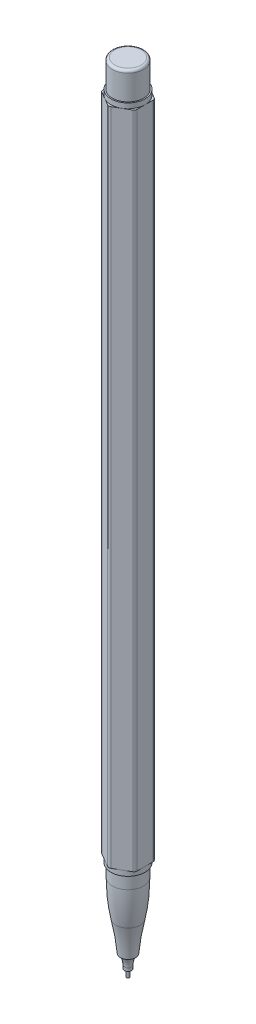
ISO-10303-21;
HEADER;
FILE_DESCRIPTION(('STEP AP214'),'2;1');
FILE_NAME('part.step','',(''),(''),'','','');
FILE_SCHEMA(('AUTOMOTIVE_DESIGN { 1 0 10303 214 1 1 1 1 }'));
ENDSEC;
DATA;
#1=APPLICATION_CONTEXT('core data for automotive mechanical design processes');
#2=APPLICATION_PROTOCOL_DEFINITION('international standard','automotive_design',2000,#1);
#3=PRODUCT_CONTEXT('',#1,'mechanical');
#4=PRODUCT('Part','Part','',(#3));
#5=PRODUCT_RELATED_PRODUCT_CATEGORY('part','',(#4));
#6=PRODUCT_DEFINITION_FORMATION('','',#4);
#7=PRODUCT_DEFINITION_CONTEXT('part definition',#1,'design');
#8=PRODUCT_DEFINITION('design','',#6,#7);
#9=PRODUCT_DEFINITION_SHAPE('','',#8);
#10=(LENGTH_UNIT() NAMED_UNIT(*) SI_UNIT(.MILLI.,.METRE.));
#11=(NAMED_UNIT(*) PLANE_ANGLE_UNIT() SI_UNIT($,.RADIAN.));
#12=(NAMED_UNIT(*) SI_UNIT($,.STERADIAN.) SOLID_ANGLE_UNIT());
#13=UNCERTAINTY_MEASURE_WITH_UNIT(LENGTH_MEASURE(1.E-05),#10,'distance_accuracy_value','');
#14=(GEOMETRIC_REPRESENTATION_CONTEXT(3) GLOBAL_UNCERTAINTY_ASSIGNED_CONTEXT((#13)) GLOBAL_UNIT_ASSIGNED_CONTEXT((#10,
#11,#12)) REPRESENTATION_CONTEXT('',''));
#15=CARTESIAN_POINT('',(0.,0.,0.));
#16=DIRECTION('',(0.,0.,1.));
#17=DIRECTION('',(1.,0.,0.));
#18=AXIS2_PLACEMENT_3D('',#15,#16,#17);
#19=CARTESIAN_POINT('',(-2.74999999999998,0.,1.58771324027151));
#20=DIRECTION('',(0.,1.,0.));
#21=DIRECTION('',(0.,0.,1.));
#22=AXIS2_PLACEMENT_3D('',#19,#20,#21);
#23=PLANE('',#22);
#24=CARTESIAN_POINT('',(0.,0.,0.));
#25=DIRECTION('',(0.,-1.,0.));
#26=DIRECTION('',(0.,0.,-1.));
#27=AXIS2_PLACEMENT_3D('',#24,#25,#26);
#28=CIRCLE('',#27,3.35000000000002);
#29=CARTESIAN_POINT('',(1.675,0.,-2.9011851026779));
#30=VERTEX_POINT('',#29);
#31=CARTESIAN_POINT('',(3.35,0.,0.));
#32=VERTEX_POINT('',#31);
#33=EDGE_CURVE('E53',#30,#32,#28,.T.);
#34=ORIENTED_EDGE('',*,*,#33,.F.);
#35=DIRECTION('',(-0.866025403784441,0.,-0.499999999999995));
#36=VECTOR('',#35,1.);
#37=CARTESIAN_POINT('',(3.04999999999999,0.,-2.10732848254215));
#38=LINE('',#37,#36);
#39=CARTESIAN_POINT('',(3.04999999999999,0.,-2.10732848254215));
#40=VERTEX_POINT('',#39);
#41=EDGE_CURVE('E171',#40,#30,#38,.T.);
#42=ORIENTED_EDGE('',*,*,#41,.F.);
#43=CARTESIAN_POINT('',(2.74999999999999,0.,-1.58771324027149));
#44=DIRECTION('',(0.,1.,0.));
#45=DIRECTION('',(0.,0.,1.));
#46=AXIS2_PLACEMENT_3D('',#43,#44,#45);
#47=CIRCLE('',#46,0.6);
#48=CARTESIAN_POINT('',(3.34999999999999,0.,-1.58771324027148));
#49=VERTEX_POINT('',#48);
#50=EDGE_CURVE('E194',#49,#40,#47,.T.);
#51=ORIENTED_EDGE('',*,*,#50,.F.);
#52=DIRECTION('',(0.,0.,-1.));
#53=VECTOR('',#52,1.);
#54=CARTESIAN_POINT('',(3.35000000000001,0.,1.58771324027146));
#55=LINE('',#54,#53);
#56=EDGE_CURVE('E197',#32,#49,#55,.T.);
#57=ORIENTED_EDGE('',*,*,#56,.F.);
#58=EDGE_LOOP('',(#34,#42,#51,#57));
#59=FACE_BOUND('',#58,.T.);
#60=ADVANCED_FACE('F41',(#59),#23,.F.);
#61=CARTESIAN_POINT('',(1.675,0.,2.90118510267787));
#62=VERTEX_POINT('',#61);
#63=EDGE_CURVE('E11',#32,#62,#28,.T.);
#64=ORIENTED_EDGE('',*,*,#63,.F.);
#65=CARTESIAN_POINT('',(3.35000000000001,0.,1.58771324027146));
#66=VERTEX_POINT('',#65);
#67=EDGE_CURVE('E298',#66,#32,#55,.T.);
#68=ORIENTED_EDGE('',*,*,#67,.F.);
#69=CARTESIAN_POINT('',(2.75000000000001,0.,1.58771324027147));
#70=DIRECTION('',(0.,1.,0.));
#71=DIRECTION('',(0.,0.,1.));
#72=AXIS2_PLACEMENT_3D('',#69,#70,#71);
#73=CIRCLE('',#72,0.6);
#74=CARTESIAN_POINT('',(3.05,0.,2.10732848254213));
#75=VERTEX_POINT('',#74);
#76=EDGE_CURVE('E295',#75,#66,#73,.T.);
#77=ORIENTED_EDGE('',*,*,#76,.F.);
#78=DIRECTION('',(0.866025403784438,0.,-0.500000000000001));
#79=VECTOR('',#78,1.);
#80=CARTESIAN_POINT('',(0.3,0.,3.69504172281361));
#81=LINE('',#80,#79);
#82=EDGE_CURVE('E290',#62,#75,#81,.T.);
#83=ORIENTED_EDGE('',*,*,#82,.F.);
#84=EDGE_LOOP('',(#64,#68,#77,#83));
#85=FACE_BOUND('',#84,.T.);
#86=ADVANCED_FACE('F379',(#85),#23,.F.);
#87=CARTESIAN_POINT('',(-1.67499999999999,0.,2.90118510267789));
#88=VERTEX_POINT('',#87);
#89=EDGE_CURVE('E51',#62,#88,#28,.T.);
#90=ORIENTED_EDGE('',*,*,#89,.F.);
#91=CARTESIAN_POINT('',(0.3,0.,3.69504172281361));
#92=VERTEX_POINT('',#91);
#93=EDGE_CURVE('E291',#92,#62,#81,.T.);
#94=ORIENTED_EDGE('',*,*,#93,.F.);
#95=CARTESIAN_POINT('',(0.,0.,3.17542648054295));
#96=DIRECTION('',(0.,1.,0.));
#97=DIRECTION('',(0.,0.,-1.));
#98=AXIS2_PLACEMENT_3D('',#95,#96,#97);
#99=CIRCLE('',#98,0.6);
#100=CARTESIAN_POINT('',(-0.300000000000001,0.,3.69504172281361));
#101=VERTEX_POINT('',#100);
#102=EDGE_CURVE('E287',#101,#92,#99,.T.);
#103=ORIENTED_EDGE('',*,*,#102,.F.);
#104=DIRECTION('',(0.866025403784442,0.,0.499999999999995));
#105=VECTOR('',#104,1.);
#106=CARTESIAN_POINT('',(-3.04999999999998,0.,2.10732848254217));
#107=LINE('',#106,#105);
#108=EDGE_CURVE('E282',#88,#101,#107,.T.);
#109=ORIENTED_EDGE('',*,*,#108,.F.);
#110=EDGE_LOOP('',(#90,#94,#103,#109));
#111=FACE_BOUND('',#110,.T.);
#112=ADVANCED_FACE('F384',(#111),#23,.F.);
#113=CARTESIAN_POINT('',(-3.35,0.,0.));
#114=VERTEX_POINT('',#113);
#115=EDGE_CURVE('E60',#88,#114,#28,.T.);
#116=ORIENTED_EDGE('',*,*,#115,.F.);
#117=CARTESIAN_POINT('',(-3.04999999999998,0.,2.10732848254217));
#118=VERTEX_POINT('',#117);
#119=EDGE_CURVE('E283',#118,#88,#107,.T.);
#120=ORIENTED_EDGE('',*,*,#119,.F.);
#121=CARTESIAN_POINT('',(-2.74999999999998,0.,1.58771324027151));
#122=DIRECTION('',(0.,1.,0.));
#123=DIRECTION('',(0.,0.,1.));
#124=AXIS2_PLACEMENT_3D('',#121,#122,#123);
#125=CIRCLE('',#124,0.6);
#126=CARTESIAN_POINT('',(-3.34999999999998,0.,1.58771324027151));
#127=VERTEX_POINT('',#126);
#128=EDGE_CURVE('E223',#127,#118,#125,.T.);
#129=ORIENTED_EDGE('',*,*,#128,.F.);
#130=DIRECTION('',(0.,0.,1.));
#131=VECTOR('',#130,1.);
#132=CARTESIAN_POINT('',(-3.35000000000002,0.,-1.58771324027144));
#133=LINE('',#132,#131);
#134=EDGE_CURVE('E313',#114,#127,#133,.T.);
#135=ORIENTED_EDGE('',*,*,#134,.F.);
#136=EDGE_LOOP('',(#116,#120,#129,#135));
#137=FACE_BOUND('',#136,.T.);
#138=ADVANCED_FACE('F404',(#137),#23,.F.);
#139=CARTESIAN_POINT('',(-1.67500000000002,0.,-2.90118510267786));
#140=VERTEX_POINT('',#139);
#141=EDGE_CURVE('E205',#114,#140,#28,.T.);
#142=ORIENTED_EDGE('',*,*,#141,.F.);
#143=CARTESIAN_POINT('',(-3.35000000000002,0.,-1.58771324027144));
#144=VERTEX_POINT('',#143);
#145=EDGE_CURVE('E234',#144,#114,#133,.T.);
#146=ORIENTED_EDGE('',*,*,#145,.F.);
#147=CARTESIAN_POINT('',(-2.75000000000002,0.,-1.58771324027145));
#148=DIRECTION('',(0.,1.,0.));
#149=DIRECTION('',(0.,0.,1.));
#150=AXIS2_PLACEMENT_3D('',#147,#148,#149);
#151=CIRCLE('',#150,0.6);
#152=CARTESIAN_POINT('',(-3.05000000000002,0.,-2.10732848254211));
#153=VERTEX_POINT('',#152);
#154=EDGE_CURVE('E310',#153,#144,#151,.T.);
#155=ORIENTED_EDGE('',*,*,#154,.F.);
#156=DIRECTION('',(-0.866025403784435,0.,0.500000000000007));
#157=VECTOR('',#156,1.);
#158=CARTESIAN_POINT('',(-0.300000000000029,0.,-3.6950417228136));
#159=LINE('',#158,#157);
#160=EDGE_CURVE('E305',#140,#153,#159,.T.);
#161=ORIENTED_EDGE('',*,*,#160,.F.);
#162=EDGE_LOOP('',(#142,#146,#155,#161));
#163=FACE_BOUND('',#162,.T.);
#164=ADVANCED_FACE('F391',(#163),#23,.F.);
#165=CARTESIAN_POINT('',(-2.74999999999998,130.,1.58771324027151));
#166=DIRECTION('',(0.,1.,0.));
#167=DIRECTION('',(0.,0.,1.));
#168=AXIS2_PLACEMENT_3D('',#165,#166,#167);
#169=PLANE('',#168);
#170=CARTESIAN_POINT('',(0.,130.,0.));
#171=DIRECTION('',(0.,1.,0.));
#172=DIRECTION('',(0.,0.,1.));
#173=AXIS2_PLACEMENT_3D('',#170,#171,#172);
#174=CIRCLE('',#173,3.35000000000001);
#175=CARTESIAN_POINT('',(1.67500000000001,130.,2.90118510267788));
#176=VERTEX_POINT('',#175);
#177=CARTESIAN_POINT('',(3.35,130.,0.));
#178=VERTEX_POINT('',#177);
#179=EDGE_CURVE('E224',#176,#178,#174,.T.);
#180=ORIENTED_EDGE('',*,*,#179,.F.);
#181=DIRECTION('',(0.866025403784438,0.,-0.500000000000001));
#182=VECTOR('',#181,1.);
#183=CARTESIAN_POINT('',(0.3,130.,3.69504172281361));
#184=LINE('',#183,#182);
#185=CARTESIAN_POINT('',(3.05,130.,2.10732848254213));
#186=VERTEX_POINT('',#185);
#187=EDGE_CURVE('E242',#176,#186,#184,.T.);
#188=ORIENTED_EDGE('',*,*,#187,.T.);
#189=CARTESIAN_POINT('',(2.75000000000001,130.,1.58771324027147));
#190=DIRECTION('',(0.,1.,0.));
#191=DIRECTION('',(0.,0.,1.));
#192=AXIS2_PLACEMENT_3D('',#189,#190,#191);
#193=CIRCLE('',#192,0.6);
#194=CARTESIAN_POINT('',(3.35000000000001,130.,1.58771324027146));
#195=VERTEX_POINT('',#194);
#196=EDGE_CURVE('E246',#186,#195,#193,.T.);
#197=ORIENTED_EDGE('',*,*,#196,.T.);
#198=DIRECTION('',(0.,0.,-1.));
#199=VECTOR('',#198,1.);
#200=CARTESIAN_POINT('',(3.35000000000001,130.,1.58771324027146));
#201=LINE('',#200,#199);
#202=EDGE_CURVE('E250',#195,#178,#201,.T.);
#203=ORIENTED_EDGE('',*,*,#202,.T.);
#204=EDGE_LOOP('',(#180,#188,#197,#203));
#205=FACE_BOUND('',#204,.T.);
#206=ADVANCED_FACE('F401',(#205),#169,.T.);
#207=CARTESIAN_POINT('',(1.67499999999998,130.,-2.90118510267788));
#208=VERTEX_POINT('',#207);
#209=EDGE_CURVE('E218',#178,#208,#174,.T.);
#210=ORIENTED_EDGE('',*,*,#209,.F.);
#211=CARTESIAN_POINT('',(3.34999999999999,130.,-1.58771324027148));
#212=VERTEX_POINT('',#211);
#213=EDGE_CURVE('E249',#178,#212,#201,.T.);
#214=ORIENTED_EDGE('',*,*,#213,.T.);
#215=CARTESIAN_POINT('',(2.74999999999999,130.,-1.58771324027149));
#216=DIRECTION('',(0.,1.,0.));
#217=DIRECTION('',(0.,0.,1.));
#218=AXIS2_PLACEMENT_3D('',#215,#216,#217);
#219=CIRCLE('',#218,0.6);
#220=CARTESIAN_POINT('',(3.04999999999999,130.,-2.10732848254215));
#221=VERTEX_POINT('',#220);
#222=EDGE_CURVE('E254',#212,#221,#219,.T.);
#223=ORIENTED_EDGE('',*,*,#222,.T.);
#224=DIRECTION('',(-0.866025403784441,0.,-0.499999999999995));
#225=VECTOR('',#224,1.);
#226=CARTESIAN_POINT('',(3.04999999999999,130.,-2.10732848254215));
#227=LINE('',#226,#225);
#228=EDGE_CURVE('E258',#221,#208,#227,.T.);
#229=ORIENTED_EDGE('',*,*,#228,.T.);
#230=EDGE_LOOP('',(#210,#214,#223,#229));
#231=FACE_BOUND('',#230,.T.);
#232=ADVANCED_FACE('F410',(#231),#169,.T.);
#233=CARTESIAN_POINT('',(-1.67500000000002,130.,-2.90118510267786));
#234=VERTEX_POINT('',#233);
#235=EDGE_CURVE('E565',#208,#234,#174,.T.);
#236=ORIENTED_EDGE('',*,*,#235,.F.);
#237=CARTESIAN_POINT('',(0.299999999999977,130.,-3.69504172281361));
#238=VERTEX_POINT('',#237);
#239=EDGE_CURVE('E257',#208,#238,#227,.T.);
#240=ORIENTED_EDGE('',*,*,#239,.T.);
#241=CARTESIAN_POINT('',(0.,130.,-3.17542648054295));
#242=DIRECTION('',(0.,1.,0.));
#243=DIRECTION('',(0.,0.,1.));
#244=AXIS2_PLACEMENT_3D('',#241,#242,#243);
#245=CIRCLE('',#244,0.6);
#246=CARTESIAN_POINT('',(-0.300000000000029,130.,-3.6950417228136));
#247=VERTEX_POINT('',#246);
#248=EDGE_CURVE('E262',#238,#247,#245,.T.);
#249=ORIENTED_EDGE('',*,*,#248,.T.);
#250=DIRECTION('',(-0.866025403784435,0.,0.500000000000007));
#251=VECTOR('',#250,1.);
#252=CARTESIAN_POINT('',(-0.300000000000029,130.,-3.6950417228136));
#253=LINE('',#252,#251);
#254=EDGE_CURVE('E266',#247,#234,#253,.T.);
#255=ORIENTED_EDGE('',*,*,#254,.T.);
#256=EDGE_LOOP('',(#236,#240,#249,#255));
#257=FACE_BOUND('',#256,.T.);
#258=ADVANCED_FACE('F567',(#257),#169,.T.);
#259=CARTESIAN_POINT('',(-3.35,130.,0.));
#260=VERTEX_POINT('',#259);
#261=EDGE_CURVE('E562',#234,#260,#174,.T.);
#262=ORIENTED_EDGE('',*,*,#261,.F.);
#263=CARTESIAN_POINT('',(-3.05000000000002,130.,-2.10732848254211));
#264=VERTEX_POINT('',#263);
#265=EDGE_CURVE('E265',#234,#264,#253,.T.);
#266=ORIENTED_EDGE('',*,*,#265,.T.);
#267=CARTESIAN_POINT('',(-2.75000000000002,130.,-1.58771324027145));
#268=DIRECTION('',(0.,1.,0.));
#269=DIRECTION('',(0.,0.,1.));
#270=AXIS2_PLACEMENT_3D('',#267,#268,#269);
#271=CIRCLE('',#270,0.6);
#272=CARTESIAN_POINT('',(-3.35000000000002,130.,-1.58771324027144));
#273=VERTEX_POINT('',#272);
#274=EDGE_CURVE('E270',#264,#273,#271,.T.);
#275=ORIENTED_EDGE('',*,*,#274,.T.);
#276=DIRECTION('',(0.,0.,1.));
#277=VECTOR('',#276,1.);
#278=CARTESIAN_POINT('',(-3.35000000000002,130.,-1.58771324027144));
#279=LINE('',#278,#277);
#280=EDGE_CURVE('E274',#273,#260,#279,.T.);
#281=ORIENTED_EDGE('',*,*,#280,.T.);
#282=EDGE_LOOP('',(#262,#266,#275,#281));
#283=FACE_BOUND('',#282,.T.);
#284=ADVANCED_FACE('F576',(#283),#169,.T.);
#285=CARTESIAN_POINT('',(-1.67499999999999,130.,2.90118510267789));
#286=VERTEX_POINT('',#285);
#287=EDGE_CURVE('E560',#260,#286,#174,.T.);
#288=ORIENTED_EDGE('',*,*,#287,.F.);
#289=CARTESIAN_POINT('',(-3.34999999999998,130.,1.58771324027151));
#290=VERTEX_POINT('',#289);
#291=EDGE_CURVE('E273',#260,#290,#279,.T.);
#292=ORIENTED_EDGE('',*,*,#291,.T.);
#293=CARTESIAN_POINT('',(-2.74999999999998,130.,1.58771324027151));
#294=DIRECTION('',(0.,1.,0.));
#295=DIRECTION('',(0.,0.,1.));
#296=AXIS2_PLACEMENT_3D('',#293,#294,#295);
#297=CIRCLE('',#296,0.6);
#298=CARTESIAN_POINT('',(-3.04999999999998,130.,2.10732848254217));
#299=VERTEX_POINT('',#298);
#300=EDGE_CURVE('E229',#290,#299,#297,.T.);
#301=ORIENTED_EDGE('',*,*,#300,.T.);
#302=DIRECTION('',(0.866025403784442,0.,0.499999999999995));
#303=VECTOR('',#302,1.);
#304=CARTESIAN_POINT('',(-3.04999999999998,130.,2.10732848254217));
#305=LINE('',#304,#303);
#306=EDGE_CURVE('E235',#299,#286,#305,.T.);
#307=ORIENTED_EDGE('',*,*,#306,.T.);
#308=EDGE_LOOP('',(#288,#292,#301,#307));
#309=FACE_BOUND('',#308,.T.);
#310=ADVANCED_FACE('F402',(#309),#169,.T.);
#311=CARTESIAN_POINT('',(-2.74999999999998,130.,1.58771324027151));
#312=DIRECTION('',(0.,-1.,0.));
#313=DIRECTION('',(0.,0.,-1.));
#314=AXIS2_PLACEMENT_3D('',#311,#312,#313);
#315=CYLINDRICAL_SURFACE('',#314,0.6);
#316=ORIENTED_EDGE('',*,*,#128,.T.);
#317=DIRECTION('',(0.,-1.,0.));
#318=VECTOR('',#317,1.);
#319=CARTESIAN_POINT('',(-3.04999999999998,130.,2.10732848254217));
#320=LINE('',#319,#318);
#321=EDGE_CURVE('E357',#299,#118,#320,.T.);
#322=ORIENTED_EDGE('',*,*,#321,.F.);
#323=ORIENTED_EDGE('',*,*,#300,.F.);
#324=DIRECTION('',(0.,-1.,0.));
#325=VECTOR('',#324,1.);
#326=CARTESIAN_POINT('',(-3.34999999999998,130.,1.58771324027151));
#327=LINE('',#326,#325);
#328=EDGE_CURVE('E278',#290,#127,#327,.T.);
#329=ORIENTED_EDGE('',*,*,#328,.T.);
#330=EDGE_LOOP('',(#316,#322,#323,#329));
#331=FACE_BOUND('',#330,.T.);
#332=ADVANCED_FACE('F582',(#331),#315,.T.);
#333=CARTESIAN_POINT('',(-3.04999999999998,130.,2.10732848254217));
#334=DIRECTION('',(0.499999999999995,0.,-0.866025403784442));
#335=DIRECTION('',(-0.866025403784442,0.,-0.499999999999995));
#336=AXIS2_PLACEMENT_3D('',#333,#334,#335);
#337=PLANE('',#336);
#338=ORIENTED_EDGE('',*,*,#119,.T.);
#339=ORIENTED_EDGE('',*,*,#108,.T.);
#340=DIRECTION('',(0.,-1.,0.));
#341=VECTOR('',#340,1.);
#342=CARTESIAN_POINT('',(-0.300000000000001,130.,3.69504172281361));
#343=LINE('',#342,#341);
#344=CARTESIAN_POINT('',(-0.300000000000001,130.,3.69504172281361));
#345=VERTEX_POINT('',#344);
#346=EDGE_CURVE('E353',#345,#101,#343,.T.);
#347=ORIENTED_EDGE('',*,*,#346,.F.);
#348=EDGE_CURVE('E233',#286,#345,#305,.T.);
#349=ORIENTED_EDGE('',*,*,#348,.F.);
#350=ORIENTED_EDGE('',*,*,#306,.F.);
#351=ORIENTED_EDGE('',*,*,#321,.T.);
#352=EDGE_LOOP('',(#338,#339,#347,#349,#350,#351));
#353=FACE_BOUND('',#352,.T.);
#354=ADVANCED_FACE('F437',(#353),#337,.F.);
#355=CARTESIAN_POINT('',(0.,130.,3.17542648054295));
#356=DIRECTION('',(0.,-1.,0.));
#357=DIRECTION('',(0.,0.,-1.));
#358=AXIS2_PLACEMENT_3D('',#355,#356,#357);
#359=CYLINDRICAL_SURFACE('',#358,0.6);
#360=ORIENTED_EDGE('',*,*,#102,.T.);
#361=DIRECTION('',(0.,-1.,0.));
#362=VECTOR('',#361,1.);
#363=CARTESIAN_POINT('',(0.3,130.,3.69504172281361));
#364=LINE('',#363,#362);
#365=CARTESIAN_POINT('',(0.3,130.,3.69504172281361));
#366=VERTEX_POINT('',#365);
#367=EDGE_CURVE('E349',#366,#92,#364,.T.);
#368=ORIENTED_EDGE('',*,*,#367,.F.);
#369=CARTESIAN_POINT('',(0.,130.,3.17542648054295));
#370=DIRECTION('',(0.,1.,0.));
#371=DIRECTION('',(0.,0.,-1.));
#372=AXIS2_PLACEMENT_3D('',#369,#370,#371);
#373=CIRCLE('',#372,0.6);
#374=EDGE_CURVE('E239',#345,#366,#373,.T.);
#375=ORIENTED_EDGE('',*,*,#374,.F.);
#376=ORIENTED_EDGE('',*,*,#346,.T.);
#377=EDGE_LOOP('',(#360,#368,#375,#376));
#378=FACE_BOUND('',#377,.T.);
#379=ADVANCED_FACE('F432',(#378),#359,.T.);
#380=CARTESIAN_POINT('',(0.3,130.,3.69504172281361));
#381=DIRECTION('',(-0.500000000000001,0.,-0.866025403784438));
#382=DIRECTION('',(-0.866025403784438,0.,0.500000000000001));
#383=AXIS2_PLACEMENT_3D('',#380,#381,#382);
#384=PLANE('',#383);
#385=ORIENTED_EDGE('',*,*,#93,.T.);
#386=ORIENTED_EDGE('',*,*,#82,.T.);
#387=DIRECTION('',(0.,-1.,0.));
#388=VECTOR('',#387,1.);
#389=CARTESIAN_POINT('',(3.05,130.,2.10732848254213));
#390=LINE('',#389,#388);
#391=EDGE_CURVE('E345',#186,#75,#390,.T.);
#392=ORIENTED_EDGE('',*,*,#391,.F.);
#393=ORIENTED_EDGE('',*,*,#187,.F.);
#394=EDGE_CURVE('E243',#366,#176,#184,.T.);
#395=ORIENTED_EDGE('',*,*,#394,.F.);
#396=ORIENTED_EDGE('',*,*,#367,.T.);
#397=EDGE_LOOP('',(#385,#386,#392,#393,#395,#396));
#398=FACE_BOUND('',#397,.T.);
#399=ADVANCED_FACE('F427',(#398),#384,.F.);
#400=CARTESIAN_POINT('',(2.75000000000001,130.,1.58771324027147));
#401=DIRECTION('',(0.,-1.,0.));
#402=DIRECTION('',(0.,0.,-1.));
#403=AXIS2_PLACEMENT_3D('',#400,#401,#402);
#404=CYLINDRICAL_SURFACE('',#403,0.6);
#405=ORIENTED_EDGE('',*,*,#76,.T.);
#406=DIRECTION('',(0.,-1.,0.));
#407=VECTOR('',#406,1.);
#408=CARTESIAN_POINT('',(3.35000000000001,130.,1.58771324027146));
#409=LINE('',#408,#407);
#410=EDGE_CURVE('E341',#195,#66,#409,.T.);
#411=ORIENTED_EDGE('',*,*,#410,.F.);
#412=ORIENTED_EDGE('',*,*,#196,.F.);
#413=ORIENTED_EDGE('',*,*,#391,.T.);
#414=EDGE_LOOP('',(#405,#411,#412,#413));
#415=FACE_BOUND('',#414,.T.);
#416=ADVANCED_FACE('F594',(#415),#404,.T.);
#417=CARTESIAN_POINT('',(3.35000000000001,130.,1.58771324027146));
#418=DIRECTION('',(-1.,0.,0.));
#419=DIRECTION('',(0.,0.,1.));
#420=AXIS2_PLACEMENT_3D('',#417,#418,#419);
#421=PLANE('',#420);
#422=ORIENTED_EDGE('',*,*,#67,.T.);
#423=ORIENTED_EDGE('',*,*,#56,.T.);
#424=DIRECTION('',(0.,-1.,0.));
#425=VECTOR('',#424,1.);
#426=CARTESIAN_POINT('',(3.34999999999999,130.,-1.58771324027148));
#427=LINE('',#426,#425);
#428=EDGE_CURVE('E337',#212,#49,#427,.T.);
#429=ORIENTED_EDGE('',*,*,#428,.F.);
#430=ORIENTED_EDGE('',*,*,#213,.F.);
#431=ORIENTED_EDGE('',*,*,#202,.F.);
#432=ORIENTED_EDGE('',*,*,#410,.T.);
#433=EDGE_LOOP('',(#422,#423,#429,#430,#431,#432));
#434=FACE_BOUND('',#433,.T.);
#435=ADVANCED_FACE('F541',(#434),#421,.F.);
#436=CARTESIAN_POINT('',(2.74999999999999,130.,-1.58771324027149));
#437=DIRECTION('',(0.,-1.,0.));
#438=DIRECTION('',(0.,0.,-1.));
#439=AXIS2_PLACEMENT_3D('',#436,#437,#438);
#440=CYLINDRICAL_SURFACE('',#439,0.6);
#441=ORIENTED_EDGE('',*,*,#50,.T.);
#442=DIRECTION('',(0.,-1.,0.));
#443=VECTOR('',#442,1.);
#444=CARTESIAN_POINT('',(3.04999999999999,130.,-2.10732848254215));
#445=LINE('',#444,#443);
#446=EDGE_CURVE('E179',#221,#40,#445,.T.);
#447=ORIENTED_EDGE('',*,*,#446,.F.);
#448=ORIENTED_EDGE('',*,*,#222,.F.);
#449=ORIENTED_EDGE('',*,*,#428,.T.);
#450=EDGE_LOOP('',(#441,#447,#448,#449));
#451=FACE_BOUND('',#450,.T.);
#452=ADVANCED_FACE('F551',(#451),#440,.T.);
#453=CARTESIAN_POINT('',(3.04999999999999,130.,-2.10732848254215));
#454=DIRECTION('',(-0.499999999999995,0.,0.866025403784441));
#455=DIRECTION('',(0.866025403784442,0.,0.499999999999995));
#456=AXIS2_PLACEMENT_3D('',#453,#454,#455);
#457=PLANE('',#456);
#458=ORIENTED_EDGE('',*,*,#41,.T.);
#459=CARTESIAN_POINT('',(0.299999999999977,0.,-3.69504172281361));
#460=VERTEX_POINT('',#459);
#461=EDGE_CURVE('E175',#30,#460,#38,.T.);
#462=ORIENTED_EDGE('',*,*,#461,.T.);
#463=DIRECTION('',(0.,-1.,0.));
#464=VECTOR('',#463,1.);
#465=CARTESIAN_POINT('',(0.299999999999977,130.,-3.69504172281361));
#466=LINE('',#465,#464);
#467=EDGE_CURVE('E332',#238,#460,#466,.T.);
#468=ORIENTED_EDGE('',*,*,#467,.F.);
#469=ORIENTED_EDGE('',*,*,#239,.F.);
#470=ORIENTED_EDGE('',*,*,#228,.F.);
#471=ORIENTED_EDGE('',*,*,#446,.T.);
#472=EDGE_LOOP('',(#458,#462,#468,#469,#470,#471));
#473=FACE_BOUND('',#472,.T.);
#474=ADVANCED_FACE('F173',(#473),#457,.F.);
#475=CARTESIAN_POINT('',(0.,130.,-3.17542648054295));
#476=DIRECTION('',(0.,-1.,0.));
#477=DIRECTION('',(0.,0.,-1.));
#478=AXIS2_PLACEMENT_3D('',#475,#476,#477);
#479=CYLINDRICAL_SURFACE('',#478,0.6);
#480=CARTESIAN_POINT('',(0.,0.,-3.17542648054295));
#481=DIRECTION('',(0.,1.,0.));
#482=DIRECTION('',(0.,0.,1.));
#483=AXIS2_PLACEMENT_3D('',#480,#481,#482);
#484=CIRCLE('',#483,0.6);
#485=CARTESIAN_POINT('',(-0.300000000000029,0.,-3.6950417228136));
#486=VERTEX_POINT('',#485);
#487=EDGE_CURVE('E184',#460,#486,#484,.T.);
#488=ORIENTED_EDGE('',*,*,#487,.T.);
#489=DIRECTION('',(0.,-1.,0.));
#490=VECTOR('',#489,1.);
#491=CARTESIAN_POINT('',(-0.300000000000029,130.,-3.6950417228136));
#492=LINE('',#491,#490);
#493=EDGE_CURVE('E328',#247,#486,#492,.T.);
#494=ORIENTED_EDGE('',*,*,#493,.F.);
#495=ORIENTED_EDGE('',*,*,#248,.F.);
#496=ORIENTED_EDGE('',*,*,#467,.T.);
#497=EDGE_LOOP('',(#488,#494,#495,#496));
#498=FACE_BOUND('',#497,.T.);
#499=ADVANCED_FACE('F604',(#498),#479,.T.);
#500=CARTESIAN_POINT('',(-0.300000000000029,130.,-3.6950417228136));
#501=DIRECTION('',(0.500000000000007,0.,0.866025403784434));
#502=DIRECTION('',(0.866025403784435,0.,-0.500000000000007));
#503=AXIS2_PLACEMENT_3D('',#500,#501,#502);
#504=PLANE('',#503);
#505=EDGE_CURVE('E306',#486,#140,#159,.T.);
#506=ORIENTED_EDGE('',*,*,#505,.T.);
#507=ORIENTED_EDGE('',*,*,#160,.T.);
#508=DIRECTION('',(0.,-1.,0.));
#509=VECTOR('',#508,1.);
#510=CARTESIAN_POINT('',(-3.05000000000002,130.,-2.10732848254211));
#511=LINE('',#510,#509);
#512=EDGE_CURVE('E324',#264,#153,#511,.T.);
#513=ORIENTED_EDGE('',*,*,#512,.F.);
#514=ORIENTED_EDGE('',*,*,#265,.F.);
#515=ORIENTED_EDGE('',*,*,#254,.F.);
#516=ORIENTED_EDGE('',*,*,#493,.T.);
#517=EDGE_LOOP('',(#506,#507,#513,#514,#515,#516));
#518=FACE_BOUND('',#517,.T.);
#519=ADVANCED_FACE('F572',(#518),#504,.F.);
#520=CARTESIAN_POINT('',(-2.75000000000002,130.,-1.58771324027145));
#521=DIRECTION('',(0.,-1.,0.));
#522=DIRECTION('',(0.,0.,-1.));
#523=AXIS2_PLACEMENT_3D('',#520,#521,#522);
#524=CYLINDRICAL_SURFACE('',#523,0.6);
#525=ORIENTED_EDGE('',*,*,#154,.T.);
#526=DIRECTION('',(0.,-1.,0.));
#527=VECTOR('',#526,1.);
#528=CARTESIAN_POINT('',(-3.35000000000002,130.,-1.58771324027144));
#529=LINE('',#528,#527);
#530=EDGE_CURVE('E320',#273,#144,#529,.T.);
#531=ORIENTED_EDGE('',*,*,#530,.F.);
#532=ORIENTED_EDGE('',*,*,#274,.F.);
#533=ORIENTED_EDGE('',*,*,#512,.T.);
#534=EDGE_LOOP('',(#525,#531,#532,#533));
#535=FACE_BOUND('',#534,.T.);
#536=ADVANCED_FACE('F610',(#535),#524,.T.);
#537=CARTESIAN_POINT('',(-3.35000000000002,130.,-1.58771324027144));
#538=DIRECTION('',(1.,0.,0.));
#539=DIRECTION('',(0.,0.,-1.));
#540=AXIS2_PLACEMENT_3D('',#537,#538,#539);
#541=PLANE('',#540);
#542=ORIENTED_EDGE('',*,*,#145,.T.);
#543=ORIENTED_EDGE('',*,*,#134,.T.);
#544=ORIENTED_EDGE('',*,*,#328,.F.);
#545=ORIENTED_EDGE('',*,*,#291,.F.);
#546=ORIENTED_EDGE('',*,*,#280,.F.);
#547=ORIENTED_EDGE('',*,*,#530,.T.);
#548=EDGE_LOOP('',(#542,#543,#544,#545,#546,#547));
#549=FACE_BOUND('',#548,.T.);
#550=ADVANCED_FACE('F399',(#549),#541,.F.);
#551=EDGE_CURVE('E228',#286,#176,#174,.T.);
#552=ORIENTED_EDGE('',*,*,#551,.F.);
#553=ORIENTED_EDGE('',*,*,#348,.T.);
#554=ORIENTED_EDGE('',*,*,#374,.T.);
#555=ORIENTED_EDGE('',*,*,#394,.T.);
#556=EDGE_LOOP('',(#552,#553,#554,#555));
#557=FACE_BOUND('',#556,.T.);
#558=ADVANCED_FACE('F390',(#557),#169,.T.);
#559=EDGE_CURVE('E191',#140,#30,#28,.T.);
#560=ORIENTED_EDGE('',*,*,#559,.F.);
#561=ORIENTED_EDGE('',*,*,#505,.F.);
#562=ORIENTED_EDGE('',*,*,#487,.F.);
#563=ORIENTED_EDGE('',*,*,#461,.F.);
#564=EDGE_LOOP('',(#560,#561,#562,#563));
#565=FACE_BOUND('',#564,.T.);
#566=ADVANCED_FACE('F188',(#565),#23,.F.);
#567=CARTESIAN_POINT('',(0.,131.,0.));
#568=DIRECTION('',(0.,-1.,0.));
#569=DIRECTION('',(0.,0.,-1.));
#570=AXIS2_PLACEMENT_3D('',#567,#568,#569);
#571=CYLINDRICAL_SURFACE('',#570,3.35000000000001);
#572=CARTESIAN_POINT('',(0.,131.,0.));
#573=DIRECTION('',(0.,1.,0.));
#574=DIRECTION('',(0.,0.,1.));
#575=AXIS2_PLACEMENT_3D('',#572,#573,#574);
#576=CIRCLE('',#575,3.35000000000001);
#577=CARTESIAN_POINT('',(0.,131.,3.35000000000001));
#578=VERTEX_POINT('',#577);
#579=EDGE_CURVE('E219',#578,#578,#576,.T.);
#580=ORIENTED_EDGE('',*,*,#579,.F.);
#581=EDGE_LOOP('',(#580));
#582=FACE_BOUND('',#581,.T.);
#583=ORIENTED_EDGE('',*,*,#179,.T.);
#584=ORIENTED_EDGE('',*,*,#209,.T.);
#585=ORIENTED_EDGE('',*,*,#235,.T.);
#586=ORIENTED_EDGE('',*,*,#261,.T.);
#587=ORIENTED_EDGE('',*,*,#287,.T.);
#588=ORIENTED_EDGE('',*,*,#551,.T.);
#589=EDGE_LOOP('',(#583,#584,#585,#586,#587,#588));
#590=FACE_BOUND('',#589,.T.);
#591=ADVANCED_FACE('F389',(#582,#590),#571,.T.);
#592=CARTESIAN_POINT('',(0.,131.,0.));
#593=DIRECTION('',(0.,1.,0.));
#594=DIRECTION('',(0.,0.,1.));
#595=AXIS2_PLACEMENT_3D('',#592,#593,#594);
#596=PLANE('',#595);
#597=CARTESIAN_POINT('',(0.,131.,0.));
#598=DIRECTION('',(0.,1.,0.));
#599=DIRECTION('',(0.,0.,1.));
#600=AXIS2_PLACEMENT_3D('',#597,#598,#599);
#601=CIRCLE('',#600,3.1);
#602=CARTESIAN_POINT('',(0.,131.,-3.1));
#603=VERTEX_POINT('',#602);
#604=EDGE_CURVE('E214',#603,#603,#601,.T.);
#605=ORIENTED_EDGE('',*,*,#604,.F.);
#606=EDGE_LOOP('',(#605));
#607=FACE_BOUND('',#606,.T.);
#608=ORIENTED_EDGE('',*,*,#579,.T.);
#609=EDGE_LOOP('',(#608));
#610=FACE_BOUND('',#609,.T.);
#611=ADVANCED_FACE('F396',(#607,#610),#596,.T.);
#612=CARTESIAN_POINT('',(0.,136.4,0.));
#613=DIRECTION('',(0.,-1.,0.));
#614=DIRECTION('',(0.,0.,-1.));
#615=AXIS2_PLACEMENT_3D('',#612,#613,#614);
#616=CYLINDRICAL_SURFACE('',#615,3.1);
#617=CARTESIAN_POINT('',(0.,135.9,0.));
#618=DIRECTION('',(0.,1.,0.));
#619=DIRECTION('',(0.,0.,1.));
#620=AXIS2_PLACEMENT_3D('',#617,#618,#619);
#621=CIRCLE('',#620,3.1);
#622=CARTESIAN_POINT('',(0.,135.9,-3.1));
#623=VERTEX_POINT('',#622);
#624=EDGE_CURVE('E45',#623,#623,#621,.F.);
#625=CARTESIAN_POINT('',(0.,135.9,-3.1));
#626=CARTESIAN_POINT('',(0.,135.848958333333,-3.1));
#627=CARTESIAN_POINT('',(0.,135.797916666667,-3.1));
#628=CARTESIAN_POINT('',(0.,135.695833333333,-3.1));
#629=CARTESIAN_POINT('',(0.,135.644791666667,-3.1));
#630=CARTESIAN_POINT('',(0.,135.542708333333,-3.1));
#631=CARTESIAN_POINT('',(0.,135.491666666667,-3.1));
#632=CARTESIAN_POINT('',(0.,135.389583333333,-3.1));
#633=CARTESIAN_POINT('',(0.,135.338541666667,-3.1));
#634=CARTESIAN_POINT('',(0.,135.236458333333,-3.1));
#635=CARTESIAN_POINT('',(0.,135.185416666667,-3.1));
#636=CARTESIAN_POINT('',(0.,135.083333333333,-3.1));
#637=CARTESIAN_POINT('',(0.,135.032291666667,-3.1));
#638=CARTESIAN_POINT('',(0.,134.930208333333,-3.1));
#639=CARTESIAN_POINT('',(0.,134.879166666667,-3.1));
#640=CARTESIAN_POINT('',(0.,134.777083333333,-3.1));
#641=CARTESIAN_POINT('',(0.,134.726041666667,-3.1));
#642=CARTESIAN_POINT('',(0.,134.623958333333,-3.1));
#643=CARTESIAN_POINT('',(0.,134.572916666667,-3.1));
#644=CARTESIAN_POINT('',(0.,134.470833333333,-3.1));
#645=CARTESIAN_POINT('',(0.,134.419791666667,-3.1));
#646=CARTESIAN_POINT('',(0.,134.317708333333,-3.1));
#647=CARTESIAN_POINT('',(0.,134.266666666667,-3.1));
#648=CARTESIAN_POINT('',(0.,134.164583333333,-3.1));
#649=CARTESIAN_POINT('',(0.,134.113541666667,-3.1));
#650=CARTESIAN_POINT('',(0.,134.011458333333,-3.1));
#651=CARTESIAN_POINT('',(0.,133.960416666667,-3.1));
#652=CARTESIAN_POINT('',(0.,133.858333333333,-3.1));
#653=CARTESIAN_POINT('',(0.,133.807291666667,-3.1));
#654=CARTESIAN_POINT('',(0.,133.705208333333,-3.1));
#655=CARTESIAN_POINT('',(0.,133.654166666667,-3.1));
#656=CARTESIAN_POINT('',(0.,133.552083333333,-3.1));
#657=CARTESIAN_POINT('',(0.,133.501041666667,-3.1));
#658=CARTESIAN_POINT('',(0.,133.398958333333,-3.1));
#659=CARTESIAN_POINT('',(0.,133.347916666667,-3.1));
#660=CARTESIAN_POINT('',(0.,133.245833333333,-3.1));
#661=CARTESIAN_POINT('',(0.,133.194791666667,-3.1));
#662=CARTESIAN_POINT('',(0.,133.092708333333,-3.1));
#663=CARTESIAN_POINT('',(0.,133.041666666667,-3.1));
#664=CARTESIAN_POINT('',(0.,132.939583333333,-3.1));
#665=CARTESIAN_POINT('',(0.,132.888541666667,-3.1));
#666=CARTESIAN_POINT('',(0.,132.786458333333,-3.1));
#667=CARTESIAN_POINT('',(0.,132.735416666667,-3.1));
#668=CARTESIAN_POINT('',(0.,132.633333333333,-3.1));
#669=CARTESIAN_POINT('',(0.,132.582291666667,-3.1));
#670=CARTESIAN_POINT('',(0.,132.480208333333,-3.1));
#671=CARTESIAN_POINT('',(0.,132.429166666667,-3.1));
#672=CARTESIAN_POINT('',(0.,132.327083333333,-3.1));
#673=CARTESIAN_POINT('',(0.,132.276041666667,-3.1));
#674=CARTESIAN_POINT('',(0.,132.173958333333,-3.1));
#675=CARTESIAN_POINT('',(0.,132.122916666667,-3.1));
#676=CARTESIAN_POINT('',(0.,132.020833333333,-3.1));
#677=CARTESIAN_POINT('',(0.,131.969791666667,-3.1));
#678=CARTESIAN_POINT('',(0.,131.867708333333,-3.1));
#679=CARTESIAN_POINT('',(0.,131.816666666667,-3.1));
#680=CARTESIAN_POINT('',(0.,131.714583333333,-3.1));
#681=CARTESIAN_POINT('',(0.,131.663541666667,-3.1));
#682=CARTESIAN_POINT('',(0.,131.561458333333,-3.1));
#683=CARTESIAN_POINT('',(0.,131.510416666667,-3.1));
#684=CARTESIAN_POINT('',(0.,131.408333333333,-3.1));
#685=CARTESIAN_POINT('',(0.,131.357291666667,-3.1));
#686=CARTESIAN_POINT('',(0.,131.255208333333,-3.1));
#687=CARTESIAN_POINT('',(0.,131.204166666667,-3.1));
#688=CARTESIAN_POINT('',(0.,131.102083333333,-3.1));
#689=CARTESIAN_POINT('',(0.,131.051041666667,-3.1));
#690=CARTESIAN_POINT('',(0.,131.,-3.1));
#691=B_SPLINE_CURVE_WITH_KNOTS('',3,(#625,#626,#627,#628,#629,#630,#631,#632,#633,#634,#635,
#636,#637,#638,#639,#640,#641,#642,#643,#644,#645,#646,#647,#648,#649,#650,#651,#652,#653,#654,
#655,#656,#657,#658,#659,#660,#661,#662,#663,#664,#665,#666,#667,#668,#669,#670,#671,#672,#673,
#674,#675,#676,#677,#678,#679,#680,#681,#682,#683,#684,#685,#686,#687,#688,#689,#690),
.UNSPECIFIED.,.F.,.F.,(4,2,2,2,2,2,2,2,2,2,2,2,2,2,2,2,2,2,2,2,2,2,2,2,2,2,2,2,2,2,2,2,4),(0.,
0.153125000000004,0.306250000000008,0.459375000000012,0.612500000000016,0.76562500000002,
0.918750000000024,1.071875,1.225,1.37812500000001,1.53125000000001,1.68437500000002,
1.83750000000002,1.990625,2.14375,2.296875,2.45000000000001,2.60312500000001,2.75625000000002,
2.90937500000002,3.0625,3.215625,3.36875,3.52187500000001,3.67500000000001,3.82812500000002,
3.98124999999999,4.134375,4.2875,4.440625,4.59375000000001,4.74687500000001,4.90000000000002),.UNSPECIFIED.);
#692=EDGE_CURVE('BSEAM375',#623,#603,#691,.T.);
#693=ORIENTED_EDGE('',*,*,#624,.T.);
#694=ORIENTED_EDGE('',*,*,#604,.T.);
#695=ORIENTED_EDGE('',*,*,#692,.T.);
#696=ORIENTED_EDGE('',*,*,#692,.F.);
#697=EDGE_LOOP('',(#693,#695,#694,#696));
#698=FACE_BOUND('',#697,.T.);
#699=ADVANCED_FACE('F375',(#698),#616,.T.);
#700=CARTESIAN_POINT('',(0.,136.4,0.));
#701=DIRECTION('',(0.,1.,0.));
#702=DIRECTION('',(0.,0.,1.));
#703=AXIS2_PLACEMENT_3D('',#700,#701,#702);
#704=PLANE('',#703);
#705=CARTESIAN_POINT('',(0.,136.4,0.));
#706=DIRECTION('',(0.,1.,0.));
#707=DIRECTION('',(0.,0.,1.));
#708=AXIS2_PLACEMENT_3D('',#705,#706,#707);
#709=CIRCLE('',#708,2.6);
#710=CARTESIAN_POINT('',(0.,136.4,2.6));
#711=VERTEX_POINT('',#710);
#712=EDGE_CURVE('E210',#711,#711,#709,.T.);
#713=ORIENTED_EDGE('',*,*,#712,.T.);
#714=EDGE_LOOP('',(#713));
#715=FACE_BOUND('',#714,.T.);
#716=ADVANCED_FACE('F364',(#715),#704,.T.);
#717=CARTESIAN_POINT('',(0.,135.9,0.));
#718=DIRECTION('',(0.,1.,0.));
#719=DIRECTION('',(0.,0.,1.));
#720=AXIS2_PLACEMENT_3D('',#717,#718,#719);
#721=TOROIDAL_SURFACE('',#720,2.6,0.5);
#722=ORIENTED_EDGE('',*,*,#624,.F.);
#723=EDGE_LOOP('',(#722));
#724=FACE_BOUND('',#723,.T.);
#725=ORIENTED_EDGE('',*,*,#712,.F.);
#726=EDGE_LOOP('',(#725));
#727=FACE_BOUND('',#726,.T.);
#728=ADVANCED_FACE('F43',(#724,#727),#721,.T.);
#729=CARTESIAN_POINT('',(0.,-1.,0.));
#730=DIRECTION('',(0.,1.,0.));
#731=DIRECTION('',(0.,0.,1.));
#732=AXIS2_PLACEMENT_3D('',#729,#730,#731);
#733=CYLINDRICAL_SURFACE('',#732,3.35000000000002);
#734=CARTESIAN_POINT('',(0.,-1.,0.));
#735=DIRECTION('',(0.,-1.,0.));
#736=DIRECTION('',(0.,0.,-1.));
#737=AXIS2_PLACEMENT_3D('',#734,#735,#736);
#738=CIRCLE('',#737,3.35000000000002);
#739=CARTESIAN_POINT('',(0.,-1.,-3.35000000000002));
#740=VERTEX_POINT('',#739);
#741=EDGE_CURVE('E201',#740,#740,#738,.T.);
#742=ORIENTED_EDGE('',*,*,#741,.F.);
#743=EDGE_LOOP('',(#742));
#744=FACE_BOUND('',#743,.T.);
#745=ORIENTED_EDGE('',*,*,#33,.T.);
#746=ORIENTED_EDGE('',*,*,#63,.T.);
#747=ORIENTED_EDGE('',*,*,#89,.T.);
#748=ORIENTED_EDGE('',*,*,#115,.T.);
#749=ORIENTED_EDGE('',*,*,#141,.T.);
#750=ORIENTED_EDGE('',*,*,#559,.T.);
#751=EDGE_LOOP('',(#745,#746,#747,#748,#749,#750));
#752=FACE_BOUND('',#751,.T.);
#753=ADVANCED_FACE('F204',(#744,#752),#733,.T.);
#754=CARTESIAN_POINT('',(0.,-1.,0.));
#755=DIRECTION('',(0.,-1.,0.));
#756=DIRECTION('',(0.,0.,-1.));
#757=AXIS2_PLACEMENT_3D('',#754,#755,#756);
#758=PLANE('',#757);
#759=CARTESIAN_POINT('',(0.,-1.,0.));
#760=DIRECTION('',(0.,1.,0.));
#761=DIRECTION('',(-1.,0.,0.));
#762=AXIS2_PLACEMENT_3D('',#759,#760,#761);
#763=CIRCLE('',#762,3.05);
#764=CARTESIAN_POINT('',(-3.05,-1.,0.));
#765=VERTEX_POINT('',#764);
#766=EDGE_CURVE('E202',#765,#765,#763,.T.);
#767=ORIENTED_EDGE('',*,*,#766,.T.);
#768=EDGE_LOOP('',(#767));
#769=FACE_BOUND('',#768,.T.);
#770=ORIENTED_EDGE('',*,*,#741,.T.);
#771=EDGE_LOOP('',(#770));
#772=FACE_BOUND('',#771,.T.);
#773=ADVANCED_FACE('F372',(#769,#772),#758,.T.);
#774=CARTESIAN_POINT('',(0.,-1.,0.));
#775=DIRECTION('',(0.,1.,0.));
#776=DIRECTION('',(-1.,0.,0.));
#777=AXIS2_PLACEMENT_3D('',#774,#775,#776);
#778=CYLINDRICAL_SURFACE('',#777,3.05);
#779=ORIENTED_EDGE('',*,*,#766,.F.);
#780=EDGE_LOOP('',(#779));
#781=FACE_BOUND('',#780,.T.);
#782=CARTESIAN_POINT('',(0.,-3.5,0.));
#783=DIRECTION('',(0.,1.,0.));
#784=DIRECTION('',(-1.,0.,0.));
#785=AXIS2_PLACEMENT_3D('',#782,#783,#784);
#786=CIRCLE('',#785,3.05);
#787=CARTESIAN_POINT('',(-3.05,-3.5,0.));
#788=VERTEX_POINT('',#787);
#789=EDGE_CURVE('E444',#788,#788,#786,.T.);
#790=ORIENTED_EDGE('',*,*,#789,.T.);
#791=EDGE_LOOP('',(#790));
#792=FACE_BOUND('',#791,.T.);
#793=ADVANCED_FACE('F511',(#781,#792),#778,.T.);
#794=CARTESIAN_POINT('',(0.,-3.5,0.));
#795=DIRECTION('',(0.,1.,0.));
#796=DIRECTION('',(-1.,0.,0.));
#797=AXIS2_PLACEMENT_3D('',#794,#795,#796);
#798=DEGENERATE_TOROIDAL_SURFACE('',#797,34.3012773228846,37.3512773228846,.F.);
#799=ORIENTED_EDGE('',*,*,#789,.F.);
#800=EDGE_LOOP('',(#799));
#801=FACE_BOUND('',#800,.T.);
#802=CARTESIAN_POINT('',(0.,-10.5,0.));
#803=DIRECTION('',(0.,1.,0.));
#804=DIRECTION('',(-1.,0.,0.));
#805=AXIS2_PLACEMENT_3D('',#802,#803,#804);
#806=CIRCLE('',#805,2.38820233615436);
#807=CARTESIAN_POINT('',(-2.38820233615436,-10.5,0.));
#808=VERTEX_POINT('',#807);
#809=EDGE_CURVE('E447',#808,#808,#806,.T.);
#810=ORIENTED_EDGE('',*,*,#809,.T.);
#811=EDGE_LOOP('',(#810));
#812=FACE_BOUND('',#811,.T.);
#813=ADVANCED_FACE('F507',(#801,#812),#798,.F.);
#814=CARTESIAN_POINT('',(0.,-19.793523471608,0.));
#815=DIRECTION('',(0.,1.,0.));
#816=DIRECTION('',(-1.,0.,0.));
#817=AXIS2_PLACEMENT_3D('',#814,#815,#816);
#818=TOROIDAL_SURFACE('',#817,44.4582213100513,43.0842903502121);
#819=ORIENTED_EDGE('',*,*,#809,.F.);
#820=EDGE_LOOP('',(#819));
#821=FACE_BOUND('',#820,.T.);
#822=CARTESIAN_POINT('',(0.,-16.5,0.));
#823=DIRECTION('',(0.,1.,0.));
#824=DIRECTION('',(-1.,0.,0.));
#825=AXIS2_PLACEMENT_3D('',#822,#823,#824);
#826=CIRCLE('',#825,1.5);
#827=CARTESIAN_POINT('',(-1.5,-16.5,0.));
#828=VERTEX_POINT('',#827);
#829=EDGE_CURVE('E451',#828,#828,#826,.T.);
#830=ORIENTED_EDGE('',*,*,#829,.T.);
#831=EDGE_LOOP('',(#830));
#832=FACE_BOUND('',#831,.T.);
#833=ADVANCED_FACE('F503',(#821,#832),#818,.F.);
#834=CARTESIAN_POINT('',(1.5,-16.5,0.));
#835=DIRECTION('',(0.,1.,0.));
#836=DIRECTION('',(-1.,0.,0.));
#837=AXIS2_PLACEMENT_3D('',#834,#835,#836);
#838=PLANE('',#837);
#839=ORIENTED_EDGE('',*,*,#829,.F.);
#840=EDGE_LOOP('',(#839));
#841=FACE_BOUND('',#840,.T.);
#842=CARTESIAN_POINT('',(0.,-16.5,0.));
#843=DIRECTION('',(0.,1.,0.));
#844=DIRECTION('',(-1.,0.,0.));
#845=AXIS2_PLACEMENT_3D('',#842,#843,#844);
#846=CIRCLE('',#845,1.2);
#847=CARTESIAN_POINT('',(-1.2,-16.5,0.));
#848=VERTEX_POINT('',#847);
#849=EDGE_CURVE('E455',#848,#848,#846,.T.);
#850=ORIENTED_EDGE('',*,*,#849,.T.);
#851=EDGE_LOOP('',(#850));
#852=FACE_BOUND('',#851,.T.);
#853=ADVANCED_FACE('F499',(#841,#852),#838,.F.);
#854=CARTESIAN_POINT('',(0.,-18.638837916399,0.));
#855=DIRECTION('',(0.,1.,0.));
#856=DIRECTION('',(-1.,0.,0.));
#857=AXIS2_PLACEMENT_3D('',#854,#855,#856);
#858=TOROIDAL_SURFACE('',#857,5.50535166559593,4.80735692424388);
#859=ORIENTED_EDGE('',*,*,#849,.F.);
#860=EDGE_LOOP('',(#859));
#861=FACE_BOUND('',#860,.T.);
#862=CARTESIAN_POINT('',(0.,-18.5,0.));
#863=DIRECTION('',(0.,1.,0.));
#864=DIRECTION('',(-1.,0.,0.));
#865=AXIS2_PLACEMENT_3D('',#862,#863,#864);
#866=CIRCLE('',#865,0.699999999999999);
#867=CARTESIAN_POINT('',(-0.699999999999997,-18.5,0.));
#868=VERTEX_POINT('',#867);
#869=EDGE_CURVE('E459',#868,#868,#866,.T.);
#870=ORIENTED_EDGE('',*,*,#869,.T.);
#871=EDGE_LOOP('',(#870));
#872=FACE_BOUND('',#871,.T.);
#873=ADVANCED_FACE('F495',(#861,#872),#858,.F.);
#874=CARTESIAN_POINT('',(0.,-1.,0.));
#875=DIRECTION('',(0.,1.,0.));
#876=DIRECTION('',(-1.,0.,0.));
#877=AXIS2_PLACEMENT_3D('',#874,#875,#876);
#878=CYLINDRICAL_SURFACE('',#877,0.699999999999999);
#879=ORIENTED_EDGE('',*,*,#869,.F.);
#880=EDGE_LOOP('',(#879));
#881=FACE_BOUND('',#880,.T.);
#882=CARTESIAN_POINT('',(0.,-19.1,0.));
#883=DIRECTION('',(0.,1.,0.));
#884=DIRECTION('',(-1.,0.,0.));
#885=AXIS2_PLACEMENT_3D('',#882,#883,#884);
#886=CIRCLE('',#885,0.7);
#887=CARTESIAN_POINT('',(-0.699999999999998,-19.1,0.));
#888=VERTEX_POINT('',#887);
#889=EDGE_CURVE('E463',#888,#888,#886,.T.);
#890=ORIENTED_EDGE('',*,*,#889,.T.);
#891=EDGE_LOOP('',(#890));
#892=FACE_BOUND('',#891,.T.);
#893=ADVANCED_FACE('F491',(#881,#892),#878,.T.);
#894=CARTESIAN_POINT('',(0.300000000000002,-19.1,0.));
#895=DIRECTION('',(0.,1.,0.));
#896=DIRECTION('',(-1.,0.,0.));
#897=AXIS2_PLACEMENT_3D('',#894,#895,#896);
#898=PLANE('',#897);
#899=ORIENTED_EDGE('',*,*,#889,.F.);
#900=EDGE_LOOP('',(#899));
#901=FACE_BOUND('',#900,.T.);
#902=CARTESIAN_POINT('',(0.,-19.1,0.));
#903=DIRECTION('',(0.,1.,0.));
#904=DIRECTION('',(-1.,0.,0.));
#905=AXIS2_PLACEMENT_3D('',#902,#903,#904);
#906=CIRCLE('',#905,0.3);
#907=CARTESIAN_POINT('',(-0.299999999999998,-19.1,0.));
#908=VERTEX_POINT('',#907);
#909=EDGE_CURVE('E467',#908,#908,#906,.T.);
#910=ORIENTED_EDGE('',*,*,#909,.T.);
#911=EDGE_LOOP('',(#910));
#912=FACE_BOUND('',#911,.T.);
#913=ADVANCED_FACE('F485',(#901,#912),#898,.F.);
#914=CARTESIAN_POINT('',(0.,-1.,0.));
#915=DIRECTION('',(0.,1.,0.));
#916=DIRECTION('',(-1.,0.,0.));
#917=AXIS2_PLACEMENT_3D('',#914,#915,#916);
#918=CYLINDRICAL_SURFACE('',#917,0.3);
#919=ORIENTED_EDGE('',*,*,#909,.F.);
#920=EDGE_LOOP('',(#919));
#921=FACE_BOUND('',#920,.T.);
#922=CARTESIAN_POINT('',(0.,-20.5,0.));
#923=DIRECTION('',(0.,1.,0.));
#924=DIRECTION('',(-1.,0.,0.));
#925=AXIS2_PLACEMENT_3D('',#922,#923,#924);
#926=CIRCLE('',#925,0.3);
#927=CARTESIAN_POINT('',(-0.299999999999998,-20.5,0.));
#928=VERTEX_POINT('',#927);
#929=EDGE_CURVE('E471',#928,#928,#926,.T.);
#930=ORIENTED_EDGE('',*,*,#929,.T.);
#931=EDGE_LOOP('',(#930));
#932=FACE_BOUND('',#931,.T.);
#933=ADVANCED_FACE('F477',(#921,#932),#918,.T.);
#934=CARTESIAN_POINT('',(0.,-20.5,0.));
#935=DIRECTION('',(0.,1.,0.));
#936=DIRECTION('',(-1.,0.,0.));
#937=AXIS2_PLACEMENT_3D('',#934,#935,#936);
#938=PLANE('',#937);
#939=ORIENTED_EDGE('',*,*,#929,.F.);
#940=EDGE_LOOP('',(#939));
#941=FACE_BOUND('',#940,.T.);
#942=ADVANCED_FACE('F479',(#941),#938,.F.);
#943=CLOSED_SHELL('',(#60,#86,#112,#138,#164,#206,#232,#258,#284,#310,#332,#354,#379,#399,#416,
#435,#452,#474,#499,#519,#536,#550,#558,#566,#591,#611,#699,#716,#728,#753,#773,#793,#813,#833,
#853,#873,#893,#913,#933,#942));
#944=MANIFOLD_SOLID_BREP('B2',#943);
#945=ADVANCED_BREP_SHAPE_REPRESENTATION('',(#18,#944),#14);
#946=SHAPE_DEFINITION_REPRESENTATION(#9,#945);
ENDSEC;
END-ISO-10303-21;
